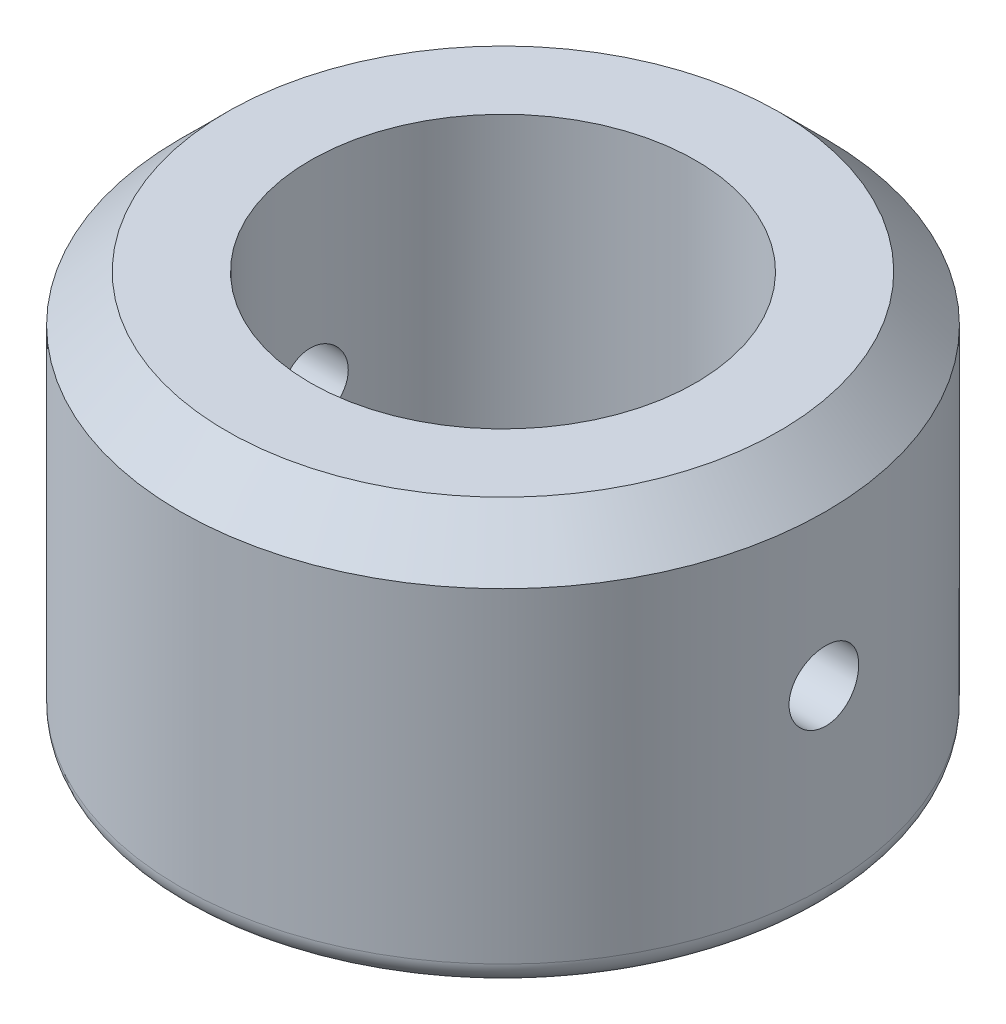
ISO-10303-21;
HEADER;
FILE_DESCRIPTION(('STEP AP214'),'2;1');
FILE_NAME('part.step','',(''),(''),'','','');
FILE_SCHEMA(('AUTOMOTIVE_DESIGN { 1 0 10303 214 1 1 1 1 }'));
ENDSEC;
DATA;
#1=APPLICATION_CONTEXT('core data for automotive mechanical design processes');
#2=APPLICATION_PROTOCOL_DEFINITION('international standard','automotive_design',2000,#1);
#3=PRODUCT_CONTEXT('',#1,'mechanical');
#4=PRODUCT('Part','Part','',(#3));
#5=PRODUCT_RELATED_PRODUCT_CATEGORY('part','',(#4));
#6=PRODUCT_DEFINITION_FORMATION('','',#4);
#7=PRODUCT_DEFINITION_CONTEXT('part definition',#1,'design');
#8=PRODUCT_DEFINITION('design','',#6,#7);
#9=PRODUCT_DEFINITION_SHAPE('','',#8);
#10=(LENGTH_UNIT() NAMED_UNIT(*) SI_UNIT(.MILLI.,.METRE.));
#11=(NAMED_UNIT(*) PLANE_ANGLE_UNIT() SI_UNIT($,.RADIAN.));
#12=(NAMED_UNIT(*) SI_UNIT($,.STERADIAN.) SOLID_ANGLE_UNIT());
#13=UNCERTAINTY_MEASURE_WITH_UNIT(LENGTH_MEASURE(1.E-05),#10,'distance_accuracy_value','');
#14=(GEOMETRIC_REPRESENTATION_CONTEXT(3) GLOBAL_UNCERTAINTY_ASSIGNED_CONTEXT((#13)) GLOBAL_UNIT_ASSIGNED_CONTEXT((#10,
#11,#12)) REPRESENTATION_CONTEXT('',''));
#15=CARTESIAN_POINT('',(0.,0.,0.));
#16=DIRECTION('',(0.,0.,1.));
#17=DIRECTION('',(1.,0.,0.));
#18=AXIS2_PLACEMENT_3D('',#15,#16,#17);
#19=CARTESIAN_POINT('',(0.,19.0131578947368,0.));
#20=DIRECTION('',(0.,1.,0.));
#21=DIRECTION('',(0.,0.,1.));
#22=AXIS2_PLACEMENT_3D('',#19,#20,#21);
#23=CYLINDRICAL_SURFACE('',#22,4.15);
#24=CARTESIAN_POINT('',(-4.08166632639171,0.,-0.75));
#25=CARTESIAN_POINT('',(-4.08166711915439,-0.0417570749172095,-0.749998370872072));
#26=CARTESIAN_POINT('',(-4.08231406806924,-0.0835356159521936,-0.746500868732766));
#27=CARTESIAN_POINT('',(-4.0848290324889,-0.165916613645916,-0.732611564216784));
#28=CARTESIAN_POINT('',(-4.08669811424747,-0.206518010968633,-0.722213741514679));
#29=CARTESIAN_POINT('',(-4.09143890023774,-0.28534073651645,-0.694851879629009));
#30=CARTESIAN_POINT('',(-4.0943097027962,-0.323564168869061,-0.677893744055687));
#31=CARTESIAN_POINT('',(-4.10072939650417,-0.396620417484143,-0.637907974102784));
#32=CARTESIAN_POINT('',(-4.10427822687873,-0.431453537214892,-0.614880883643259));
#33=CARTESIAN_POINT('',(-4.11169997902547,-0.497146500440764,-0.563126821487064));
#34=CARTESIAN_POINT('',(-4.11557587845491,-0.527961424086928,-0.534343250395212));
#35=CARTESIAN_POINT('',(-4.1231887031625,-0.584352304422463,-0.472015616702808));
#36=CARTESIAN_POINT('',(-4.12692561961164,-0.609927928745037,-0.438471252318931));
#37=CARTESIAN_POINT('',(-4.13387120389906,-0.655285179202409,-0.367280493407978));
#38=CARTESIAN_POINT('',(-4.13707595675359,-0.675024632480302,-0.329606814971572));
#39=CARTESIAN_POINT('',(-4.14256285895915,-0.707877720553624,-0.251410467067998));
#40=CARTESIAN_POINT('',(-4.14484507877549,-0.720991861425628,-0.210888015474706));
#41=CARTESIAN_POINT('',(-4.14820874217597,-0.7400836575121,-0.128609464675913));
#42=CARTESIAN_POINT('',(-4.14930290530956,-0.746136960484582,-0.0868714472161352));
#43=CARTESIAN_POINT('',(-4.15021096717177,-0.751170796603711,-0.00295884058928596));
#44=CARTESIAN_POINT('',(-4.1500249674985,-0.750151891025014,0.0392157136674748));
#45=CARTESIAN_POINT('',(-4.14840364424008,-0.741128579948108,0.1222859566332));
#46=CARTESIAN_POINT('',(-4.14698288618486,-0.733205613648285,0.163190816696737));
#47=CARTESIAN_POINT('',(-4.14306798249985,-0.710727696832687,0.24308076106555));
#48=CARTESIAN_POINT('',(-4.14057379984281,-0.696172517541057,0.282065779095143));
#49=CARTESIAN_POINT('',(-4.13476778914566,-0.660764624799748,0.357247634809045));
#50=CARTESIAN_POINT('',(-4.13145170738974,-0.63987901892288,0.393428639464076));
#51=CARTESIAN_POINT('',(-4.12436920449572,-0.592427326248551,0.461802950057926));
#52=CARTESIAN_POINT('',(-4.12060274071414,-0.565860701367533,0.493995877805462));
#53=CARTESIAN_POINT('',(-4.11297387807316,-0.50735132333439,0.553962278046568));
#54=CARTESIAN_POINT('',(-4.10911087699922,-0.47533734179189,0.581666220818848));
#55=CARTESIAN_POINT('',(-4.10177584203735,-0.407080196380398,0.631321531933009));
#56=CARTESIAN_POINT('',(-4.09830381309734,-0.370836979000343,0.653272827477216));
#57=CARTESIAN_POINT('',(-4.09214314207107,-0.295061904041133,0.690817452522338));
#58=CARTESIAN_POINT('',(-4.08945567427542,-0.25552522951263,0.706401265293634));
#59=CARTESIAN_POINT('',(-4.08518684020403,-0.174335487464313,0.730685984698734));
#60=CARTESIAN_POINT('',(-4.08360535814813,-0.132682641965749,0.739387611806838));
#61=CARTESIAN_POINT('',(-4.08175030079712,-0.0490682637844616,0.749560660780985));
#62=CARTESIAN_POINT('',(-4.08145870444964,-0.00711924041938971,0.751131712395754));
#63=CARTESIAN_POINT('',(-4.08216828597263,0.0764419189375291,0.747265553437296));
#64=CARTESIAN_POINT('',(-4.08316940468161,0.118054070258726,0.741828663584614));
#65=CARTESIAN_POINT('',(-4.08633487506276,0.199436480387029,0.724186290793566));
#66=CARTESIAN_POINT('',(-4.08849033517919,0.239218327038988,0.712032523434706));
#67=CARTESIAN_POINT('',(-4.09371403013747,0.316180875217548,0.681356053443713));
#68=CARTESIAN_POINT('',(-4.09678232804897,0.353361396794462,0.662832910725846));
#69=CARTESIAN_POINT('',(-4.10352729966377,0.424506312339542,0.619712225336678));
#70=CARTESIAN_POINT('',(-4.10721016697707,0.458431775909847,0.595051438151531));
#71=CARTESIAN_POINT('',(-4.11475165927688,0.521698966356748,0.540441286664133));
#72=CARTESIAN_POINT('',(-4.11861029887648,0.551040311224381,0.510491482054067));
#73=CARTESIAN_POINT('',(-4.12612617033843,0.604675742885781,0.445709680024158));
#74=CARTESIAN_POINT('',(-4.12978032586212,0.628903012583962,0.410821949626396));
#75=CARTESIAN_POINT('',(-4.13642458205976,0.67115220897292,0.337413588769979));
#76=CARTESIAN_POINT('',(-4.13941470698936,0.689174362336946,0.298893091082016));
#77=CARTESIAN_POINT('',(-4.14438071857773,0.718400376564486,0.219501932605797));
#78=CARTESIAN_POINT('',(-4.14636158617644,0.729637773821384,0.178643942588973));
#79=CARTESIAN_POINT('',(-4.14910707856436,0.745082663206578,0.0955815717001904));
#80=CARTESIAN_POINT('',(-4.14987182185243,0.749290840262349,0.0533773224162343));
#81=CARTESIAN_POINT('',(-4.1500967736188,0.750535380628233,-0.0305373964439204));
#82=CARTESIAN_POINT('',(-4.14957538371078,0.74767290790091,-0.0722463503371712));
#83=CARTESIAN_POINT('',(-4.14732466223161,0.735078039593648,-0.154578753442988));
#84=CARTESIAN_POINT('',(-4.14559534051687,0.72534570007011,-0.195202211510121));
#85=CARTESIAN_POINT('',(-4.14112278252864,0.699328738116929,-0.274161984494633));
#86=CARTESIAN_POINT('',(-4.13838110083085,0.683054158543172,-0.312501702029063));
#87=CARTESIAN_POINT('',(-4.13218145079545,0.644426507841527,-0.385921579665081));
#88=CARTESIAN_POINT('',(-4.12872343909585,0.622073068713098,-0.421001542255848));
#89=CARTESIAN_POINT('',(-4.12141503331434,0.5715704626006,-0.487412144711058));
#90=CARTESIAN_POINT('',(-4.11756001455435,0.543347860291798,-0.518686437392932));
#91=CARTESIAN_POINT('',(-4.10992219893724,0.482061117769602,-0.576090447527865));
#92=CARTESIAN_POINT('',(-4.1061394192402,0.448995842982076,-0.602218956018953));
#93=CARTESIAN_POINT('',(-4.09903939502413,0.378626920734395,-0.64879690896143));
#94=CARTESIAN_POINT('',(-4.09572637929307,0.341289646944732,-0.669196211691804));
#95=CARTESIAN_POINT('',(-4.08999153367857,0.263671299986249,-0.70340069122095));
#96=CARTESIAN_POINT('',(-4.0875688464004,0.223393104008321,-0.717212215952087));
#97=CARTESIAN_POINT('',(-4.08440507300397,0.152485530176664,-0.73497654905568));
#98=CARTESIAN_POINT('',(-4.083384008797,0.122276363300291,-0.740600899714032));
#99=CARTESIAN_POINT('',(-4.08201435213586,0.0613819902103686,-0.74811317934488));
#100=CARTESIAN_POINT('',(-4.08166574360967,0.0306967953917894,-0.750001197617572));
#101=CARTESIAN_POINT('',(-4.08166632639171,0.,-0.75));
#102=B_SPLINE_CURVE_WITH_KNOTS('',3,(#24,#25,#26,#27,#28,#29,#30,#31,#32,#33,#34,#35,#36,#37,
#38,#39,#40,#41,#42,#43,#44,#45,#46,#47,#48,#49,#50,#51,#52,#53,#54,#55,#56,#57,#58,#59,#60,#61,
#62,#63,#64,#65,#66,#67,#68,#69,#70,#71,#72,#73,#74,#75,#76,#77,#78,#79,#80,#81,#82,#83,#84,#85,
#86,#87,#88,#89,#90,#91,#92,#93,#94,#95,#96,#97,#98,#99,#100,#101),.UNSPECIFIED.,.T.,.F.,(4,2,2,
2,2,2,2,2,2,2,2,2,2,2,2,2,2,2,2,2,2,2,2,2,2,2,2,2,2,2,2,2,2,2,2,2,2,2,4),(0.,0.125158918276986,
0.250427177818935,0.375582969996053,0.500727549104118,0.627169108018629,0.753618685557069,
0.880960841975968,1.0082932698529,1.13424858728513,1.26019390858694,1.38467340732397,
1.50915720026263,1.63429922443711,1.75945310682129,1.88639079099145,2.0133300814346,
2.14045840522167,2.26757341858347,2.39290677679134,2.51823439928409,2.64261025921679,
2.76699471450469,2.89271817189248,3.01845210062771,3.14573902294484,3.27302129497012,
3.39966915958709,3.52630468291142,3.65113887985669,3.77597205819781,3.90061433507571,
4.02526415919824,4.1515791672641,4.27792381674807,4.40534202211349,4.53263719898484,
4.62464722463679,4.71665505117693),.UNSPECIFIED.);
#103=CARTESIAN_POINT('',(-4.08166632639171,0.,-0.75));
#104=VERTEX_POINT('',#103);
#105=EDGE_CURVE('E76',#104,#104,#102,.T.);
#106=ORIENTED_EDGE('',*,*,#105,.T.);
#107=EDGE_LOOP('',(#106));
#108=FACE_BOUND('',#107,.T.);
#109=CARTESIAN_POINT('',(4.08166632639171,0.,-0.75));
#110=CARTESIAN_POINT('',(4.08166711915439,0.0417570749172095,-0.749998370872072));
#111=CARTESIAN_POINT('',(4.08231406806924,0.0835356159521936,-0.746500868732766));
#112=CARTESIAN_POINT('',(4.0848290324889,0.165916613645916,-0.732611564216784));
#113=CARTESIAN_POINT('',(4.08669811424747,0.206518010968633,-0.722213741514679));
#114=CARTESIAN_POINT('',(4.09143890023774,0.28534073651645,-0.694851879629009));
#115=CARTESIAN_POINT('',(4.0943097027962,0.323564168869061,-0.677893744055687));
#116=CARTESIAN_POINT('',(4.10072939650417,0.396620417484143,-0.637907974102784));
#117=CARTESIAN_POINT('',(4.10427822687873,0.431453537214892,-0.614880883643259));
#118=CARTESIAN_POINT('',(4.11169997902547,0.497146500440764,-0.563126821487064));
#119=CARTESIAN_POINT('',(4.11557587845491,0.527961424086928,-0.534343250395212));
#120=CARTESIAN_POINT('',(4.1231887031625,0.584352304422463,-0.472015616702808));
#121=CARTESIAN_POINT('',(4.12692561961164,0.609927928745037,-0.438471252318931));
#122=CARTESIAN_POINT('',(4.13387120389906,0.655285179202409,-0.367280493407978));
#123=CARTESIAN_POINT('',(4.13707595675359,0.675024632480302,-0.329606814971572));
#124=CARTESIAN_POINT('',(4.14256285895915,0.707877720553624,-0.251410467067998));
#125=CARTESIAN_POINT('',(4.14484507877549,0.720991861425628,-0.210888015474706));
#126=CARTESIAN_POINT('',(4.14820874217597,0.7400836575121,-0.128609464675913));
#127=CARTESIAN_POINT('',(4.14930290530956,0.746136960484582,-0.0868714472161352));
#128=CARTESIAN_POINT('',(4.15021096717177,0.751170796603711,-0.00295884058928596));
#129=CARTESIAN_POINT('',(4.1500249674985,0.750151891025014,0.0392157136674748));
#130=CARTESIAN_POINT('',(4.14840364424008,0.741128579948108,0.1222859566332));
#131=CARTESIAN_POINT('',(4.14698288618486,0.733205613648285,0.163190816696737));
#132=CARTESIAN_POINT('',(4.14306798249985,0.710727696832687,0.24308076106555));
#133=CARTESIAN_POINT('',(4.14057379984281,0.696172517541057,0.282065779095143));
#134=CARTESIAN_POINT('',(4.13476778914566,0.660764624799748,0.357247634809045));
#135=CARTESIAN_POINT('',(4.13145170738974,0.63987901892288,0.393428639464076));
#136=CARTESIAN_POINT('',(4.12436920449572,0.592427326248551,0.461802950057926));
#137=CARTESIAN_POINT('',(4.12060274071414,0.565860701367533,0.493995877805462));
#138=CARTESIAN_POINT('',(4.11297387807316,0.50735132333439,0.553962278046568));
#139=CARTESIAN_POINT('',(4.10911087699922,0.47533734179189,0.581666220818848));
#140=CARTESIAN_POINT('',(4.10177584203735,0.407080196380398,0.631321531933009));
#141=CARTESIAN_POINT('',(4.09830381309734,0.370836979000343,0.653272827477216));
#142=CARTESIAN_POINT('',(4.09214314207107,0.295061904041133,0.690817452522338));
#143=CARTESIAN_POINT('',(4.08945567427542,0.25552522951263,0.706401265293634));
#144=CARTESIAN_POINT('',(4.08518684020403,0.174335487464313,0.730685984698734));
#145=CARTESIAN_POINT('',(4.08360535814813,0.132682641965749,0.739387611806838));
#146=CARTESIAN_POINT('',(4.08175030079712,0.0490682637844616,0.749560660780985));
#147=CARTESIAN_POINT('',(4.08145870444964,0.00711924041938971,0.751131712395754));
#148=CARTESIAN_POINT('',(4.08216828597263,-0.0764419189375291,0.747265553437296));
#149=CARTESIAN_POINT('',(4.08316940468161,-0.118054070258726,0.741828663584614));
#150=CARTESIAN_POINT('',(4.08633487506276,-0.199436480387029,0.724186290793566));
#151=CARTESIAN_POINT('',(4.08849033517919,-0.239218327038988,0.712032523434706));
#152=CARTESIAN_POINT('',(4.09371403013747,-0.316180875217548,0.681356053443713));
#153=CARTESIAN_POINT('',(4.09678232804897,-0.353361396794462,0.662832910725846));
#154=CARTESIAN_POINT('',(4.10352729966377,-0.424506312339542,0.619712225336678));
#155=CARTESIAN_POINT('',(4.10721016697707,-0.458431775909847,0.595051438151531));
#156=CARTESIAN_POINT('',(4.11475165927688,-0.521698966356748,0.540441286664133));
#157=CARTESIAN_POINT('',(4.11861029887648,-0.551040311224381,0.510491482054067));
#158=CARTESIAN_POINT('',(4.12612617033843,-0.604675742885781,0.445709680024158));
#159=CARTESIAN_POINT('',(4.12978032586212,-0.628903012583962,0.410821949626396));
#160=CARTESIAN_POINT('',(4.13642458205976,-0.67115220897292,0.337413588769979));
#161=CARTESIAN_POINT('',(4.13941470698936,-0.689174362336946,0.298893091082016));
#162=CARTESIAN_POINT('',(4.14438071857773,-0.718400376564486,0.219501932605797));
#163=CARTESIAN_POINT('',(4.14636158617644,-0.729637773821384,0.178643942588973));
#164=CARTESIAN_POINT('',(4.14910707856436,-0.745082663206578,0.0955815717001904));
#165=CARTESIAN_POINT('',(4.14987182185243,-0.749290840262349,0.0533773224162343));
#166=CARTESIAN_POINT('',(4.1500967736188,-0.750535380628233,-0.0305373964439204));
#167=CARTESIAN_POINT('',(4.14957538371078,-0.74767290790091,-0.0722463503371712));
#168=CARTESIAN_POINT('',(4.14732466223161,-0.735078039593648,-0.154578753442988));
#169=CARTESIAN_POINT('',(4.14559534051687,-0.72534570007011,-0.195202211510121));
#170=CARTESIAN_POINT('',(4.14112278252864,-0.699328738116929,-0.274161984494633));
#171=CARTESIAN_POINT('',(4.13838110083085,-0.683054158543172,-0.312501702029063));
#172=CARTESIAN_POINT('',(4.13218145079545,-0.644426507841527,-0.385921579665081));
#173=CARTESIAN_POINT('',(4.12872343909585,-0.622073068713098,-0.421001542255848));
#174=CARTESIAN_POINT('',(4.12141503331434,-0.5715704626006,-0.487412144711058));
#175=CARTESIAN_POINT('',(4.11756001455435,-0.543347860291798,-0.518686437392932));
#176=CARTESIAN_POINT('',(4.10992219893724,-0.482061117769602,-0.576090447527865));
#177=CARTESIAN_POINT('',(4.1061394192402,-0.448995842982076,-0.602218956018953));
#178=CARTESIAN_POINT('',(4.09903939502413,-0.378626920734395,-0.64879690896143));
#179=CARTESIAN_POINT('',(4.09572637929307,-0.341289646944732,-0.669196211691804));
#180=CARTESIAN_POINT('',(4.08999153367857,-0.263671299986249,-0.70340069122095));
#181=CARTESIAN_POINT('',(4.0875688464004,-0.223393104008321,-0.717212215952087));
#182=CARTESIAN_POINT('',(4.08440507300397,-0.152485530176664,-0.73497654905568));
#183=CARTESIAN_POINT('',(4.083384008797,-0.122276363300291,-0.740600899714032));
#184=CARTESIAN_POINT('',(4.08201435213586,-0.0613819902103686,-0.74811317934488));
#185=CARTESIAN_POINT('',(4.08166574360967,-0.0306967953917894,-0.750001197617572));
#186=CARTESIAN_POINT('',(4.08166632639171,0.,-0.75));
#187=B_SPLINE_CURVE_WITH_KNOTS('',3,(#109,#110,#111,#112,#113,#114,#115,#116,#117,#118,#119,
#120,#121,#122,#123,#124,#125,#126,#127,#128,#129,#130,#131,#132,#133,#134,#135,#136,#137,#138,
#139,#140,#141,#142,#143,#144,#145,#146,#147,#148,#149,#150,#151,#152,#153,#154,#155,#156,#157,
#158,#159,#160,#161,#162,#163,#164,#165,#166,#167,#168,#169,#170,#171,#172,#173,#174,#175,#176,
#177,#178,#179,#180,#181,#182,#183,#184,#185,#186),.UNSPECIFIED.,.T.,.F.,(4,2,2,2,2,2,2,2,2,2,2,
2,2,2,2,2,2,2,2,2,2,2,2,2,2,2,2,2,2,2,2,2,2,2,2,2,2,2,4),(0.,0.125158918276986,
0.250427177818935,0.375582969996053,0.500727549104118,0.627169108018629,0.753618685557069,
0.880960841975968,1.0082932698529,1.13424858728513,1.26019390858694,1.38467340732397,
1.50915720026263,1.63429922443711,1.75945310682129,1.88639079099145,2.0133300814346,
2.14045840522167,2.26757341858347,2.39290677679134,2.51823439928409,2.64261025921679,
2.76699471450469,2.89271817189248,3.01845210062771,3.14573902294484,3.27302129497012,
3.39966915958709,3.52630468291142,3.65113887985669,3.77597205819781,3.90061433507571,
4.02526415919824,4.1515791672641,4.27792381674807,4.40534202211349,4.53263719898484,
4.62464722463679,4.71665505117693),.UNSPECIFIED.);
#188=CARTESIAN_POINT('',(4.08166632639171,0.,-0.75));
#189=VERTEX_POINT('',#188);
#190=EDGE_CURVE('E71',#189,#189,#187,.T.);
#191=ORIENTED_EDGE('',*,*,#190,.T.);
#192=EDGE_LOOP('',(#191));
#193=FACE_BOUND('',#192,.T.);
#194=CARTESIAN_POINT('',(0.,-4.25,0.));
#195=DIRECTION('',(0.,1.,0.));
#196=DIRECTION('',(0.,0.,1.));
#197=AXIS2_PLACEMENT_3D('',#194,#195,#196);
#198=CIRCLE('',#197,4.15);
#199=CARTESIAN_POINT('',(0.,-4.25,4.15));
#200=VERTEX_POINT('',#199);
#201=EDGE_CURVE('E101',#200,#200,#198,.T.);
#202=ORIENTED_EDGE('',*,*,#201,.F.);
#203=EDGE_LOOP('',(#202));
#204=FACE_BOUND('',#203,.T.);
#205=CARTESIAN_POINT('',(0.,4.25,0.));
#206=DIRECTION('',(0.,1.,0.));
#207=DIRECTION('',(0.,0.,1.));
#208=AXIS2_PLACEMENT_3D('',#205,#206,#207);
#209=CIRCLE('',#208,4.15);
#210=CARTESIAN_POINT('',(0.,4.25,4.15));
#211=VERTEX_POINT('',#210);
#212=EDGE_CURVE('E104',#211,#211,#209,.T.);
#213=ORIENTED_EDGE('',*,*,#212,.T.);
#214=EDGE_LOOP('',(#213));
#215=FACE_BOUND('',#214,.T.);
#216=ADVANCED_FACE('F31',(#108,#193,#204,#215),#23,.F.);
#217=CARTESIAN_POINT('',(0.,-4.25,-4.15));
#218=DIRECTION('',(0.,1.,0.));
#219=DIRECTION('',(0.,0.,1.));
#220=AXIS2_PLACEMENT_3D('',#217,#218,#219);
#221=PLANE('',#220);
#222=CARTESIAN_POINT('',(0.,-4.25,0.));
#223=DIRECTION('',(0.,1.,0.));
#224=DIRECTION('',(0.,0.,1.));
#225=AXIS2_PLACEMENT_3D('',#222,#223,#224);
#226=CIRCLE('',#225,6.45);
#227=CARTESIAN_POINT('',(0.,-4.25,6.45));
#228=VERTEX_POINT('',#227);
#229=EDGE_CURVE('E10',#228,#228,#226,.F.);
#230=ORIENTED_EDGE('',*,*,#229,.T.);
#231=EDGE_LOOP('',(#230));
#232=FACE_BOUND('',#231,.T.);
#233=ORIENTED_EDGE('',*,*,#201,.T.);
#234=EDGE_LOOP('',(#233));
#235=FACE_BOUND('',#234,.T.);
#236=ADVANCED_FACE('F82',(#232,#235),#221,.F.);
#237=CARTESIAN_POINT('',(0.,19.0131578947368,0.));
#238=DIRECTION('',(0.,1.,0.));
#239=DIRECTION('',(0.,0.,1.));
#240=AXIS2_PLACEMENT_3D('',#237,#238,#239);
#241=CYLINDRICAL_SURFACE('',#240,6.95);
#242=CARTESIAN_POINT('',(0.,-3.75,0.));
#243=DIRECTION('',(0.,1.,0.));
#244=DIRECTION('',(0.,0.,1.));
#245=AXIS2_PLACEMENT_3D('',#242,#243,#244);
#246=CIRCLE('',#245,6.95);
#247=CARTESIAN_POINT('',(0.,-3.75,6.95));
#248=VERTEX_POINT('',#247);
#249=EDGE_CURVE('E38',#248,#248,#246,.T.);
#250=ORIENTED_EDGE('',*,*,#249,.T.);
#251=EDGE_LOOP('',(#250));
#252=FACE_BOUND('',#251,.T.);
#253=CARTESIAN_POINT('',(-6.95,0.75,0.));
#254=CARTESIAN_POINT('',(-6.9499994828106,0.749998190696393,0.0419968277177397));
#255=CARTESIAN_POINT('',(-6.94961530038675,0.746460651340338,0.0840209768288472));
#256=CARTESIAN_POINT('',(-6.94811966612771,0.732402829500536,0.166902938047631));
#257=CARTESIAN_POINT('',(-6.94700742530461,0.721874971516721,0.207759434596904));
#258=CARTESIAN_POINT('',(-6.94418115258634,0.69414766524792,0.287093971659507));
#259=CARTESIAN_POINT('',(-6.94246749645944,0.676952382112662,0.325573479716877));
#260=CARTESIAN_POINT('',(-6.93862970937493,0.636386735729325,0.399092209737456));
#261=CARTESIAN_POINT('',(-6.93650565676154,0.613017550759758,0.434132086400101));
#262=CARTESIAN_POINT('',(-6.93207490402368,0.560663311185528,0.499930683253492));
#263=CARTESIAN_POINT('',(-6.92976755672983,0.531657783053202,0.530673071177873));
#264=CARTESIAN_POINT('',(-6.92523557859431,0.468898001416712,0.586863560066261));
#265=CARTESIAN_POINT('',(-6.9230109516921,0.435143522114731,0.612311409148762));
#266=CARTESIAN_POINT('',(-6.91888977326236,0.363740497726465,0.657249275994137));
#267=CARTESIAN_POINT('',(-6.91699404997098,0.326082492775194,0.676724345191797));
#268=CARTESIAN_POINT('',(-6.91375352695691,0.248006816077591,0.709068375769091));
#269=CARTESIAN_POINT('',(-6.91240871151154,0.207589223127237,0.721937525681738));
#270=CARTESIAN_POINT('',(-6.91042823925257,0.125309260981036,0.740655591575865));
#271=CARTESIAN_POINT('',(-6.90978982980161,0.0834531597433855,0.746531763758085));
#272=CARTESIAN_POINT('',(-6.90928595078255,-0.000655659996745393,0.751181350974423));
#273=CARTESIAN_POINT('',(-6.90942045775878,-0.0429083664245994,0.749954981549351));
#274=CARTESIAN_POINT('',(-6.91044469790099,-0.12642251034229,0.740456735079786));
#275=CARTESIAN_POINT('',(-6.9113312327605,-0.167687385959642,0.732214694537665));
#276=CARTESIAN_POINT('',(-6.91375464634776,-0.248244774465506,0.708965529419995));
#277=CARTESIAN_POINT('',(-6.91529153515695,-0.287537256768431,0.693958299973736));
#278=CARTESIAN_POINT('',(-6.91884615512341,-0.363128284769582,0.657572077345802));
#279=CARTESIAN_POINT('',(-6.92086487747512,-0.39942044844594,0.636179926521048));
#280=CARTESIAN_POINT('',(-6.92515489172525,-0.467910773025987,0.587640547351125));
#281=CARTESIAN_POINT('',(-6.92742619223598,-0.500108794248913,0.560493122736244));
#282=CARTESIAN_POINT('',(-6.93197969015587,-0.559670171837588,0.501047544772254));
#283=CARTESIAN_POINT('',(-6.93426188357961,-0.587007832084844,0.468723638350801));
#284=CARTESIAN_POINT('',(-6.93856903270649,-0.635873041544792,0.39993185660156));
#285=CARTESIAN_POINT('',(-6.94059398804422,-0.657400582504298,0.363463975387423));
#286=CARTESIAN_POINT('',(-6.94415933099724,-0.694033741225167,0.287401040336446));
#287=CARTESIAN_POINT('',(-6.94569961348204,-0.709137965952944,0.247805310364183));
#288=CARTESIAN_POINT('',(-6.94812103178303,-0.732476449375202,0.166619444601147));
#289=CARTESIAN_POINT('',(-6.94900219056542,-0.740710947436263,0.125029378353798));
#290=CARTESIAN_POINT('',(-6.95000311928025,-0.750043425349791,0.0412578554518547));
#291=CARTESIAN_POINT('',(-6.95012667028126,-0.751176845874283,-0.000919609646578767));
#292=CARTESIAN_POINT('',(-6.94960862187593,-0.746368209219599,-0.0848638850670744));
#293=CARTESIAN_POINT('',(-6.94896703454057,-0.740426263662905,-0.126630701857131));
#294=CARTESIAN_POINT('',(-6.94699319852435,-0.721664979774126,-0.208465113882492));
#295=CARTESIAN_POINT('',(-6.94566262554178,-0.708862324910843,-0.248536577796961));
#296=CARTESIAN_POINT('',(-6.94245999452991,-0.67676024624935,-0.325963283210451));
#297=CARTESIAN_POINT('',(-6.94058792248794,-0.657460654324177,-0.36331845438715));
#298=CARTESIAN_POINT('',(-6.93650205950316,-0.612825282631557,-0.434411866555907));
#299=CARTESIAN_POINT('',(-6.93428696808971,-0.587466322907844,-0.468135478250094));
#300=CARTESIAN_POINT('',(-6.92976755012633,-0.531465168738117,-0.530860175898937));
#301=CARTESIAN_POINT('',(-6.92746322096156,-0.500822819388114,-0.559861123341052));
#302=CARTESIAN_POINT('',(-6.92301357615759,-0.434969630142174,-0.612441108122166));
#303=CARTESIAN_POINT('',(-6.92086897046155,-0.399740108367299,-0.635996816190469));
#304=CARTESIAN_POINT('',(-6.91699266752932,-0.325804314965822,-0.676857056018044));
#305=CARTESIAN_POINT('',(-6.91526096385324,-0.287098097577027,-0.694161685275443));
#306=CARTESIAN_POINT('',(-6.91241110214068,-0.207386257093356,-0.721989871063368));
#307=CARTESIAN_POINT('',(-6.91129170820474,-0.166385451325501,-0.732527094620024));
#308=CARTESIAN_POINT('',(-6.90978946429164,-0.0831837241643329,-0.746565609254336));
#309=CARTESIAN_POINT('',(-6.90940658938636,-0.0409828434376451,-0.750067138461271));
#310=CARTESIAN_POINT('',(-6.90942132121757,0.0431891774155807,-0.749931254337997));
#311=CARTESIAN_POINT('',(-6.90981492148569,0.0851603821868144,-0.746330487557433));
#312=CARTESIAN_POINT('',(-6.9113296918327,0.167897752379176,-0.732169286040854));
#313=CARTESIAN_POINT('',(-6.91245086254034,0.208663916758899,-0.721608845290422));
#314=CARTESIAN_POINT('',(-6.9152932978562,0.287832372113553,-0.693838587561126));
#315=CARTESIAN_POINT('',(-6.91701444669441,0.3262351174461,-0.676630053309397));
#316=CARTESIAN_POINT('',(-6.92086313145177,0.399613258641444,-0.636055794458949));
#317=CARTESIAN_POINT('',(-6.92299066727546,0.434588655309322,-0.612690071306552));
#318=CARTESIAN_POINT('',(-6.92742556731925,0.500307016641564,-0.560327458905378));
#319=CARTESIAN_POINT('',(-6.92973377044695,0.531028148199731,-0.531303237733789));
#320=CARTESIAN_POINT('',(-6.93426232689984,0.587179251263483,-0.468502849351474));
#321=CARTESIAN_POINT('',(-6.9364826591557,0.612607959924157,-0.434725551206498));
#322=CARTESIAN_POINT('',(-6.94059211070862,0.657511791027439,-0.363269333945315));
#323=CARTESIAN_POINT('',(-6.94248025636211,0.676969532572111,-0.325579443949259));
#324=CARTESIAN_POINT('',(-6.94570228286788,0.709253477982619,-0.24747009272502));
#325=CARTESIAN_POINT('',(-6.94703678172445,0.722087079926538,-0.207053733829037));
#326=CARTESIAN_POINT('',(-6.94866979423852,0.737595600647465,-0.138678420590944));
#327=CARTESIAN_POINT('',(-6.94916626512217,0.742240799558696,-0.111154949964651));
#328=CARTESIAN_POINT('',(-6.94983153888647,0.748443592191338,-0.0557583334880049));
#329=CARTESIAN_POINT('',(-6.95000034340509,0.750001201347256,-0.0278851893863296));
#330=CARTESIAN_POINT('',(-6.95,0.75,0.));
#331=B_SPLINE_CURVE_WITH_KNOTS('',3,(#253,#254,#255,#256,#257,#258,#259,#260,#261,#262,#263,
#264,#265,#266,#267,#268,#269,#270,#271,#272,#273,#274,#275,#276,#277,#278,#279,#280,#281,#282,
#283,#284,#285,#286,#287,#288,#289,#290,#291,#292,#293,#294,#295,#296,#297,#298,#299,#300,#301,
#302,#303,#304,#305,#306,#307,#308,#309,#310,#311,#312,#313,#314,#315,#316,#317,#318,#319,#320,
#321,#322,#323,#324,#325,#326,#327,#328,#329,#330),.UNSPECIFIED.,.T.,.F.,(4,2,2,2,2,2,2,2,2,2,2,
2,2,2,2,2,2,2,2,2,2,2,2,2,2,2,2,2,2,2,2,2,2,2,2,2,2,2,4),(0.,0.125888648463561,
0.251913947263212,0.377860644395014,0.503783322159158,0.630172254710554,0.756567198693704,
0.883275947599926,1.00998108003591,1.13619072525581,1.26239654041201,1.3880682892248,
1.51374198620773,1.63967647301912,1.76561525521304,1.89220124772889,2.01878742005727,
2.14540103132335,2.27201023072059,2.39798703126484,2.52396184439856,2.64963170035048,
2.77530480862199,2.90146659801367,3.02763208697892,3.15432848801617,3.28102291288331,
3.40746066234659,3.53389413234068,3.65967693517678,3.78545984671211,3.91121850097182,
4.03697712569089,4.16335895824047,4.28977091274755,4.41654742385422,4.54318203833703,
4.62677040781941,4.71035835945206),.UNSPECIFIED.);
#332=CARTESIAN_POINT('',(-6.95,0.75,0.));
#333=VERTEX_POINT('',#332);
#334=EDGE_CURVE('E42',#333,#333,#331,.T.);
#335=ORIENTED_EDGE('',*,*,#334,.T.);
#336=EDGE_LOOP('',(#335));
#337=FACE_BOUND('',#336,.T.);
#338=CARTESIAN_POINT('',(6.90941386804988,0.,-0.75));
#339=CARTESIAN_POINT('',(6.90941439657491,-0.041996024968148,-0.749998189981767));
#340=CARTESIAN_POINT('',(6.90980088009291,-0.0840193738030162,-0.746460781293276));
#341=CARTESIAN_POINT('',(6.91130473323631,-0.166899672313468,-0.732403525641218));
#342=CARTESIAN_POINT('',(6.91242289609974,-0.207755305800907,-0.721876100384831));
#343=CARTESIAN_POINT('',(6.91526201189352,-0.287088017725663,-0.69415005992578));
#344=CARTESIAN_POINT('',(6.91698258654942,-0.325566571014418,-0.676955630431115));
#345=CARTESIAN_POINT('',(6.92083219820641,-0.399083700599289,-0.636391994448269));
#346=CARTESIAN_POINT('',(6.92296115738126,-0.434122930410481,-0.613023964149775));
#347=CARTESIAN_POINT('',(6.92739769641541,-0.499922254968667,-0.56067089210801));
#348=CARTESIAN_POINT('',(6.92970591605682,-0.53066581320674,-0.531665118763231));
#349=CARTESIAN_POINT('',(6.9342351083968,-0.586858561596808,-0.468904354950771));
#350=CARTESIAN_POINT('',(6.93645607699977,-0.612307503458227,-0.435149141882901));
#351=CARTESIAN_POINT('',(6.94056692485868,-0.65724651516911,-0.363745471893292));
#352=CARTESIAN_POINT('',(6.94245597981311,-0.676721836560553,-0.326087681306362));
#353=CARTESIAN_POINT('',(6.94568316897915,-0.70906639248693,-0.248012470444621));
#354=CARTESIAN_POINT('',(6.94702131866596,-0.721935812587323,-0.207595127724148));
#355=CARTESIAN_POINT('',(6.94899142787347,-0.74065443989505,-0.125315942611162));
#356=CARTESIAN_POINT('',(6.94962613101781,-0.7465309280086,-0.0834603734000525));
#357=CARTESIAN_POINT('',(6.95012717658101,-0.751181331431629,0.000647403834236656));
#358=CARTESIAN_POINT('',(6.94999354194473,-0.749955458838975,0.0428995999753227));
#359=CARTESIAN_POINT('',(6.94897520671434,-0.740458001029345,0.126415929462615));
#360=CARTESIAN_POINT('',(6.94809363339204,-0.732215752114208,0.167683442394521));
#361=CARTESIAN_POINT('',(6.94568204858026,-0.708965256893654,0.248245997868476));
#362=CARTESIAN_POINT('',(6.94415202749345,-0.693956910446625,0.287541011206983));
#363=CARTESIAN_POINT('',(6.94061014515027,-0.657568370778585,0.363135115349481));
#364=CARTESIAN_POINT('',(6.9385973102001,-0.636175279833051,0.399427950137441));
#365=CARTESIAN_POINT('',(6.93431546576997,-0.587633891899571,0.467919218643253));
#366=CARTESIAN_POINT('',(6.93204644753482,-0.560485398190019,0.500117512348112));
#367=CARTESIAN_POINT('',(6.92749301713616,-0.501039059371284,0.559677690028739));
#368=CARTESIAN_POINT('',(6.92520858544678,-0.468715680103227,0.58701409352131));
#369=CARTESIAN_POINT('',(6.92089329669572,-0.399925401747398,0.635877018115968));
#370=CARTESIAN_POINT('',(6.91886244010854,-0.363458494906493,0.657403528346657));
#371=CARTESIAN_POINT('',(6.91528413103602,-0.287395829075766,0.694035944598596));
#372=CARTESIAN_POINT('',(6.91373680735594,-0.247799239903342,0.709140140206162));
#373=CARTESIAN_POINT('',(6.91130338314727,-0.166611505774,0.732478302335945));
#374=CARTESIAN_POINT('',(6.91041725907621,-0.125020431888265,0.740712513470125));
#375=CARTESIAN_POINT('',(6.90941071694126,-0.0412484319363321,0.750043908521043));
#376=CARTESIAN_POINT('',(6.90928646785647,0.000928472297666812,0.751176801429408));
#377=CARTESIAN_POINT('',(6.90980762830491,0.0848714994316377,0.746367309724809));
#378=CARTESIAN_POINT('',(6.91045302569218,0.12663762880365,0.740425036766578));
#379=CARTESIAN_POINT('',(6.91243727142156,0.20846857903691,0.721663825002697));
#380=CARTESIAN_POINT('',(6.91377440484033,0.248537343374493,0.708861889593854));
#381=CARTESIAN_POINT('',(6.91699007199252,0.325958967717942,0.676762153408989));
#382=CARTESIAN_POINT('',(6.9188686200928,0.363311755620281,0.657464180253177));
#383=CARTESIAN_POINT('',(6.9229646993174,0.434403530051947,0.612831198989542));
#384=CARTESIAN_POINT('',(6.92518354263894,0.468127628824088,0.587472599862036));
#385=CARTESIAN_POINT('',(6.92970596435482,0.530853477064703,0.531471880477682));
#386=CARTESIAN_POINT('',(6.93200954519353,0.559855090174689,0.500829607711016));
#387=CARTESIAN_POINT('',(6.9364535138981,0.612436533237836,0.434976130782905));
#388=CARTESIAN_POINT('',(6.93859317372463,0.635993018243089,0.399746230560512));
#389=CARTESIAN_POINT('',(6.94245754026281,0.676854620916242,0.325809471199506));
#390=CARTESIAN_POINT('',(6.9441822534645,0.69415983636052,0.287102666455131));
#391=CARTESIAN_POINT('',(6.94701912897332,0.721988405515303,0.207391180663044));
#392=CARTESIAN_POINT('',(6.94813254796777,0.732525680270762,0.166391406229545));
#393=CARTESIAN_POINT('',(6.94962655900598,0.746564646697784,0.083191855782849));
#394=CARTESIAN_POINT('',(6.95000717527747,0.750066570970262,0.0409921194892614));
#395=CARTESIAN_POINT('',(6.94999265402464,0.749931847634738,-0.0431805638711468));
#396=CARTESIAN_POINT('',(6.94960144688927,0.746331367913005,-0.0851535741656316));
#397=CARTESIAN_POINT('',(6.94809500279903,0.732170105743157,-0.167894627560321));
#398=CARTESIAN_POINT('',(6.94697976554902,0.721609320457809,-0.208662670169337));
#399=CARTESIAN_POINT('',(6.94415014321876,0.693837655858034,-0.287834920225081));
#400=CARTESIAN_POINT('',(6.94243587177869,0.676628037799469,-0.326239574395912));
#401=CARTESIAN_POINT('',(6.93859889904729,0.636051019732708,-0.399621081595737));
#402=CARTESIAN_POINT('',(6.93647619799308,0.612683623299477,-0.434597936614761));
#403=CARTESIAN_POINT('',(6.93204699422499,0.560319160514218,-0.500316236771167));
#404=CARTESIAN_POINT('',(6.92973964413635,0.53129514560752,-0.531036152831501));
#405=CARTESIAN_POINT('',(6.9252082691081,0.468495671257773,-0.587184899778281));
#406=CARTESIAN_POINT('',(6.92298426421052,0.434719078127788,-0.612612464621081));
#407=CARTESIAN_POINT('',(6.91886445995986,0.36326344526309,-0.657515053087371));
#408=CARTESIAN_POINT('',(6.91696963709661,0.325573307424486,-0.676972493382132));
#409=CARTESIAN_POINT('',(6.9137342896045,0.247463432595654,-0.709255807104274));
#410=CARTESIAN_POINT('',(6.91239314661547,0.207046799641164,-0.722089082557145));
#411=CARTESIAN_POINT('',(6.91075157372978,0.138672358358302,-0.737596691318831));
#412=CARTESIAN_POINT('',(6.91025234277766,0.11115009812421,-0.742241479723674));
#413=CARTESIAN_POINT('',(6.90958331531684,0.0557559059988115,-0.748443727081507));
#414=CARTESIAN_POINT('',(6.90941351712669,0.0278839758929819,-0.750001201792427));
#415=CARTESIAN_POINT('',(6.90941386804988,0.,-0.75));
#416=B_SPLINE_CURVE_WITH_KNOTS('',3,(#338,#339,#340,#341,#342,#343,#344,#345,#346,#347,#348,
#349,#350,#351,#352,#353,#354,#355,#356,#357,#358,#359,#360,#361,#362,#363,#364,#365,#366,#367,
#368,#369,#370,#371,#372,#373,#374,#375,#376,#377,#378,#379,#380,#381,#382,#383,#384,#385,#386,
#387,#388,#389,#390,#391,#392,#393,#394,#395,#396,#397,#398,#399,#400,#401,#402,#403,#404,#405,
#406,#407,#408,#409,#410,#411,#412,#413,#414,#415),.UNSPECIFIED.,.T.,.F.,(4,2,2,2,2,2,2,2,2,2,2,
2,2,2,2,2,2,2,2,2,2,2,2,2,2,2,2,2,2,2,2,2,2,2,2,2,2,2,4),(0.,0.125886237096352,
0.251909178287033,0.377853126975708,0.503773098201981,0.630165186515903,0.756563200640496,
0.883270816438855,1.00997487271629,1.13618299201888,1.26238734238658,1.38806659460485,
1.51374770699968,1.63968444442227,1.76562548709917,1.89220827594317,2.01879130164564,
2.14540801830651,2.2720202264731,2.39799525076431,2.52396828704258,2.64963050229299,
2.77529605239689,2.90145896011348,3.02762551005051,3.15432333724943,3.28101918267634,
3.40745358444001,3.5338838059938,3.6596718632451,3.78545997177147,3.91122423052475,
4.03698841626439,4.16336708202514,4.28977594560661,4.41655361440753,4.54318930996191,
4.6267740473193,4.71035835805146),.UNSPECIFIED.);
#417=CARTESIAN_POINT('',(6.90941386804988,0.,-0.75));
#418=VERTEX_POINT('',#417);
#419=EDGE_CURVE('E46',#418,#418,#416,.T.);
#420=ORIENTED_EDGE('',*,*,#419,.T.);
#421=EDGE_LOOP('',(#420));
#422=FACE_BOUND('',#421,.T.);
#423=CARTESIAN_POINT('',(0.,3.25,0.));
#424=DIRECTION('',(0.,-1.,0.));
#425=DIRECTION('',(0.,0.,-1.));
#426=AXIS2_PLACEMENT_3D('',#423,#424,#425);
#427=CIRCLE('',#426,6.95);
#428=CARTESIAN_POINT('',(0.,3.25,-6.95));
#429=VERTEX_POINT('',#428);
#430=EDGE_CURVE('E97',#429,#429,#427,.T.);
#431=ORIENTED_EDGE('',*,*,#430,.T.);
#432=EDGE_LOOP('',(#431));
#433=FACE_BOUND('',#432,.T.);
#434=ADVANCED_FACE('F56',(#252,#337,#422,#433),#241,.T.);
#435=CARTESIAN_POINT('',(0.,4.25,-4.15));
#436=DIRECTION('',(0.,-1.,0.));
#437=DIRECTION('',(0.,0.,-1.));
#438=AXIS2_PLACEMENT_3D('',#435,#436,#437);
#439=PLANE('',#438);
#440=CARTESIAN_POINT('',(0.,4.25,0.));
#441=DIRECTION('',(0.,-1.,0.));
#442=DIRECTION('',(0.,0.,-1.));
#443=AXIS2_PLACEMENT_3D('',#440,#441,#442);
#444=CIRCLE('',#443,5.95);
#445=CARTESIAN_POINT('',(0.,4.25,-5.95));
#446=VERTEX_POINT('',#445);
#447=EDGE_CURVE('E100',#446,#446,#444,.F.);
#448=ORIENTED_EDGE('',*,*,#447,.T.);
#449=EDGE_LOOP('',(#448));
#450=FACE_BOUND('',#449,.T.);
#451=ORIENTED_EDGE('',*,*,#212,.F.);
#452=EDGE_LOOP('',(#451));
#453=FACE_BOUND('',#452,.T.);
#454=ADVANCED_FACE('F65',(#450,#453),#439,.F.);
#455=CARTESIAN_POINT('',(0.,4.25,0.));
#456=DIRECTION('',(0.,-1.,0.));
#457=DIRECTION('',(0.,0.,-1.));
#458=AXIS2_PLACEMENT_3D('',#455,#456,#457);
#459=CONICAL_SURFACE('',#458,5.95,0.78539816339745);
#460=ORIENTED_EDGE('',*,*,#430,.F.);
#461=EDGE_LOOP('',(#460));
#462=FACE_BOUND('',#461,.T.);
#463=ORIENTED_EDGE('',*,*,#447,.F.);
#464=EDGE_LOOP('',(#463));
#465=FACE_BOUND('',#464,.T.);
#466=ADVANCED_FACE('F84',(#462,#465),#459,.T.);
#467=CARTESIAN_POINT('',(-6.95,0.,0.));
#468=DIRECTION('',(1.,0.,0.));
#469=DIRECTION('',(0.,0.,-1.));
#470=AXIS2_PLACEMENT_3D('',#467,#468,#469);
#471=CYLINDRICAL_SURFACE('',#470,0.75);
#472=ORIENTED_EDGE('',*,*,#419,.F.);
#473=EDGE_LOOP('',(#472));
#474=FACE_BOUND('',#473,.T.);
#475=ORIENTED_EDGE('',*,*,#190,.F.);
#476=EDGE_LOOP('',(#475));
#477=FACE_BOUND('',#476,.T.);
#478=ADVANCED_FACE('F63',(#474,#477),#471,.F.);
#479=ORIENTED_EDGE('',*,*,#334,.F.);
#480=EDGE_LOOP('',(#479));
#481=FACE_BOUND('',#480,.T.);
#482=ORIENTED_EDGE('',*,*,#105,.F.);
#483=EDGE_LOOP('',(#482));
#484=FACE_BOUND('',#483,.T.);
#485=ADVANCED_FACE('F60',(#481,#484),#471,.F.);
#486=CARTESIAN_POINT('',(0.,-3.75,0.));
#487=DIRECTION('',(0.,1.,0.));
#488=DIRECTION('',(0.,0.,1.));
#489=AXIS2_PLACEMENT_3D('',#486,#487,#488);
#490=TOROIDAL_SURFACE('',#489,6.45,0.5);
#491=ORIENTED_EDGE('',*,*,#229,.F.);
#492=EDGE_LOOP('',(#491));
#493=FACE_BOUND('',#492,.T.);
#494=ORIENTED_EDGE('',*,*,#249,.F.);
#495=EDGE_LOOP('',(#494));
#496=FACE_BOUND('',#495,.T.);
#497=ADVANCED_FACE('F33',(#493,#496),#490,.T.);
#498=CLOSED_SHELL('',(#216,#236,#434,#454,#466,#478,#485,#497));
#499=MANIFOLD_SOLID_BREP('B2',#498);
#500=ADVANCED_BREP_SHAPE_REPRESENTATION('',(#18,#499),#14);
#501=SHAPE_DEFINITION_REPRESENTATION(#9,#500);
ENDSEC;
END-ISO-10303-21;
